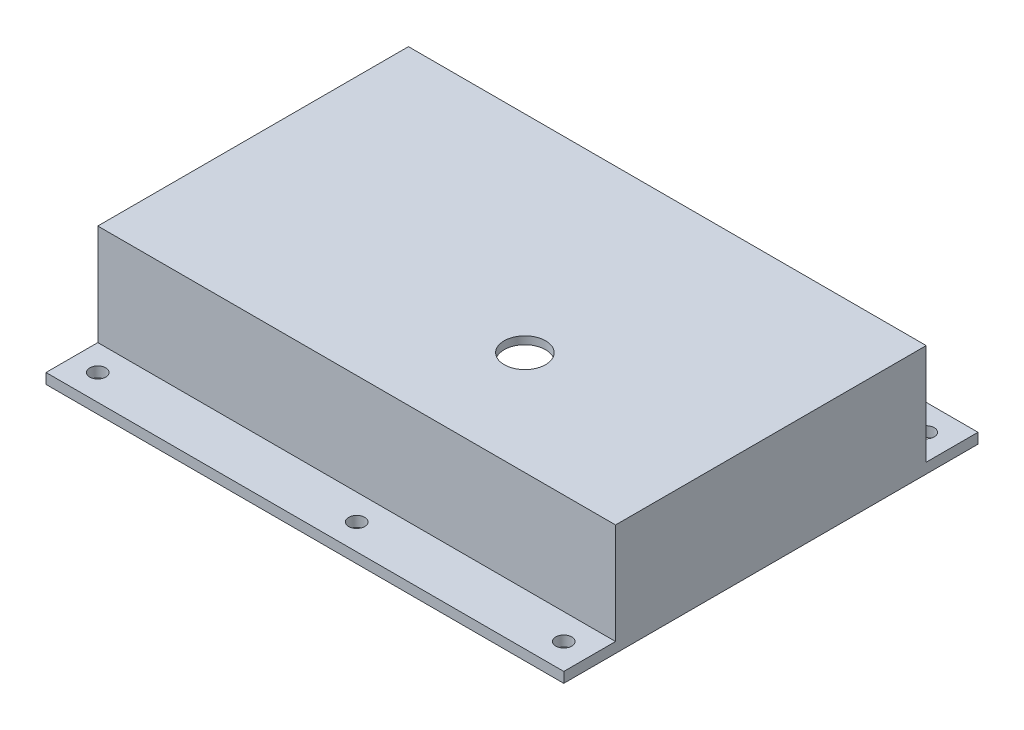
ISO-10303-21;
HEADER;
FILE_DESCRIPTION(('STEP AP214'),'2;1');
FILE_NAME('part.step','',(''),(''),'','','');
FILE_SCHEMA(('AUTOMOTIVE_DESIGN { 1 0 10303 214 1 1 1 1 }'));
ENDSEC;
DATA;
#1=APPLICATION_CONTEXT('core data for automotive mechanical design processes');
#2=APPLICATION_PROTOCOL_DEFINITION('international standard','automotive_design',2000,#1);
#3=PRODUCT_CONTEXT('',#1,'mechanical');
#4=PRODUCT('Part','Part','',(#3));
#5=PRODUCT_RELATED_PRODUCT_CATEGORY('part','',(#4));
#6=PRODUCT_DEFINITION_FORMATION('','',#4);
#7=PRODUCT_DEFINITION_CONTEXT('part definition',#1,'design');
#8=PRODUCT_DEFINITION('design','',#6,#7);
#9=PRODUCT_DEFINITION_SHAPE('','',#8);
#10=(LENGTH_UNIT() NAMED_UNIT(*) SI_UNIT(.MILLI.,.METRE.));
#11=(NAMED_UNIT(*) PLANE_ANGLE_UNIT() SI_UNIT($,.RADIAN.));
#12=(NAMED_UNIT(*) SI_UNIT($,.STERADIAN.) SOLID_ANGLE_UNIT());
#13=UNCERTAINTY_MEASURE_WITH_UNIT(LENGTH_MEASURE(1.E-05),#10,'distance_accuracy_value','');
#14=(GEOMETRIC_REPRESENTATION_CONTEXT(3) GLOBAL_UNCERTAINTY_ASSIGNED_CONTEXT((#13)) GLOBAL_UNIT_ASSIGNED_CONTEXT((#10,
#11,#12)) REPRESENTATION_CONTEXT('',''));
#15=CARTESIAN_POINT('',(0.,0.,0.));
#16=DIRECTION('',(0.,0.,1.));
#17=DIRECTION('',(1.,0.,0.));
#18=AXIS2_PLACEMENT_3D('',#15,#16,#17);
#19=CARTESIAN_POINT('',(0.,20.,-30.));
#20=DIRECTION('',(0.,0.,-1.));
#21=DIRECTION('',(-1.,0.,0.));
#22=AXIS2_PLACEMENT_3D('',#19,#20,#21);
#23=PLANE('',#22);
#24=DIRECTION('',(1.,0.,0.));
#25=VECTOR('',#24,1.);
#26=CARTESIAN_POINT('',(-50.,2.,-30.));
#27=LINE('',#26,#25);
#28=CARTESIAN_POINT('',(-50.,2.,-30.));
#29=VERTEX_POINT('',#28);
#30=CARTESIAN_POINT('',(50.,2.,-30.));
#31=VERTEX_POINT('',#30);
#32=EDGE_CURVE('E63',#29,#31,#27,.T.);
#33=ORIENTED_EDGE('',*,*,#32,.F.);
#34=DIRECTION('',(0.,-1.,0.));
#35=VECTOR('',#34,1.);
#36=CARTESIAN_POINT('',(-50.,20.,-30.));
#37=LINE('',#36,#35);
#38=CARTESIAN_POINT('',(-50.,21.5,-30.));
#39=VERTEX_POINT('',#38);
#40=EDGE_CURVE('E11',#39,#29,#37,.T.);
#41=ORIENTED_EDGE('',*,*,#40,.F.);
#42=DIRECTION('',(-1.,0.,0.));
#43=VECTOR('',#42,1.);
#44=CARTESIAN_POINT('',(-50.,21.5,-30.));
#45=LINE('',#44,#43);
#46=CARTESIAN_POINT('',(50.,21.5,-30.));
#47=VERTEX_POINT('',#46);
#48=EDGE_CURVE('E136',#47,#39,#45,.T.);
#49=ORIENTED_EDGE('',*,*,#48,.F.);
#50=DIRECTION('',(0.,-1.,0.));
#51=VECTOR('',#50,1.);
#52=CARTESIAN_POINT('',(50.,20.,-30.));
#53=LINE('',#52,#51);
#54=EDGE_CURVE('E134',#47,#31,#53,.T.);
#55=ORIENTED_EDGE('',*,*,#54,.T.);
#56=EDGE_LOOP('',(#33,#41,#49,#55));
#57=FACE_BOUND('',#56,.T.);
#58=ADVANCED_FACE('F46',(#57),#23,.T.);
#59=CARTESIAN_POINT('',(-50.,20.,0.));
#60=DIRECTION('',(-1.,0.,0.));
#61=DIRECTION('',(0.,0.,1.));
#62=AXIS2_PLACEMENT_3D('',#59,#60,#61);
#63=PLANE('',#62);
#64=DIRECTION('',(0.,0.,-1.));
#65=VECTOR('',#64,1.);
#66=CARTESIAN_POINT('',(-50.,0.,0.));
#67=LINE('',#66,#65);
#68=CARTESIAN_POINT('',(-50.,0.,40.));
#69=VERTEX_POINT('',#68);
#70=CARTESIAN_POINT('',(-50.,0.,-40.));
#71=VERTEX_POINT('',#70);
#72=EDGE_CURVE('E216',#69,#71,#67,.T.);
#73=ORIENTED_EDGE('',*,*,#72,.F.);
#74=DIRECTION('',(0.,-1.,0.));
#75=VECTOR('',#74,1.);
#76=CARTESIAN_POINT('',(-50.,0.,40.));
#77=LINE('',#76,#75);
#78=CARTESIAN_POINT('',(-50.,2.,40.));
#79=VERTEX_POINT('',#78);
#80=EDGE_CURVE('E169',#79,#69,#77,.T.);
#81=ORIENTED_EDGE('',*,*,#80,.F.);
#82=DIRECTION('',(0.,0.,1.));
#83=VECTOR('',#82,1.);
#84=CARTESIAN_POINT('',(-50.,2.,30.));
#85=LINE('',#84,#83);
#86=CARTESIAN_POINT('',(-50.,2.,30.));
#87=VERTEX_POINT('',#86);
#88=EDGE_CURVE('E166',#87,#79,#85,.T.);
#89=ORIENTED_EDGE('',*,*,#88,.F.);
#90=DIRECTION('',(0.,-1.,0.));
#91=VECTOR('',#90,1.);
#92=CARTESIAN_POINT('',(-50.,20.,30.));
#93=LINE('',#92,#91);
#94=CARTESIAN_POINT('',(-50.,21.5,30.));
#95=VERTEX_POINT('',#94);
#96=EDGE_CURVE('E55',#95,#87,#93,.T.);
#97=ORIENTED_EDGE('',*,*,#96,.F.);
#98=DIRECTION('',(0.,0.,1.));
#99=VECTOR('',#98,1.);
#100=CARTESIAN_POINT('',(-50.,21.5,-30.));
#101=LINE('',#100,#99);
#102=EDGE_CURVE('E180',#39,#95,#101,.T.);
#103=ORIENTED_EDGE('',*,*,#102,.F.);
#104=ORIENTED_EDGE('',*,*,#40,.T.);
#105=DIRECTION('',(0.,0.,1.));
#106=VECTOR('',#105,1.);
#107=CARTESIAN_POINT('',(-50.,2.,-30.));
#108=LINE('',#107,#106);
#109=CARTESIAN_POINT('',(-50.,2.,-40.));
#110=VERTEX_POINT('',#109);
#111=EDGE_CURVE('E149',#110,#29,#108,.T.);
#112=ORIENTED_EDGE('',*,*,#111,.F.);
#113=DIRECTION('',(0.,1.,0.));
#114=VECTOR('',#113,1.);
#115=CARTESIAN_POINT('',(-50.,0.,-40.));
#116=LINE('',#115,#114);
#117=EDGE_CURVE('E157',#71,#110,#116,.T.);
#118=ORIENTED_EDGE('',*,*,#117,.F.);
#119=EDGE_LOOP('',(#73,#81,#89,#97,#103,#104,#112,#118));
#120=FACE_BOUND('',#119,.T.);
#121=ADVANCED_FACE('F263',(#120),#63,.T.);
#122=CARTESIAN_POINT('',(0.,20.,30.));
#123=DIRECTION('',(0.,0.,-1.));
#124=DIRECTION('',(-1.,0.,0.));
#125=AXIS2_PLACEMENT_3D('',#122,#123,#124);
#126=PLANE('',#125);
#127=ORIENTED_EDGE('',*,*,#96,.T.);
#128=DIRECTION('',(1.,0.,0.));
#129=VECTOR('',#128,1.);
#130=CARTESIAN_POINT('',(-50.,2.,30.));
#131=LINE('',#130,#129);
#132=CARTESIAN_POINT('',(50.,2.,30.));
#133=VERTEX_POINT('',#132);
#134=EDGE_CURVE('E173',#87,#133,#131,.T.);
#135=ORIENTED_EDGE('',*,*,#134,.T.);
#136=DIRECTION('',(0.,-1.,0.));
#137=VECTOR('',#136,1.);
#138=CARTESIAN_POINT('',(50.,20.,30.));
#139=LINE('',#138,#137);
#140=CARTESIAN_POINT('',(50.,21.5,30.));
#141=VERTEX_POINT('',#140);
#142=EDGE_CURVE('E141',#141,#133,#139,.T.);
#143=ORIENTED_EDGE('',*,*,#142,.F.);
#144=DIRECTION('',(1.,0.,0.));
#145=VECTOR('',#144,1.);
#146=CARTESIAN_POINT('',(-50.,21.5,30.));
#147=LINE('',#146,#145);
#148=EDGE_CURVE('E186',#95,#141,#147,.T.);
#149=ORIENTED_EDGE('',*,*,#148,.F.);
#150=EDGE_LOOP('',(#127,#135,#143,#149));
#151=FACE_BOUND('',#150,.T.);
#152=ADVANCED_FACE('F268',(#151),#126,.F.);
#153=CARTESIAN_POINT('',(48.5,20.,0.));
#154=DIRECTION('',(-1.,0.,0.));
#155=DIRECTION('',(0.,0.,1.));
#156=AXIS2_PLACEMENT_3D('',#153,#154,#155);
#157=PLANE('',#156);
#158=DIRECTION('',(0.,0.,-1.));
#159=VECTOR('',#158,1.);
#160=CARTESIAN_POINT('',(48.5,0.,0.));
#161=LINE('',#160,#159);
#162=CARTESIAN_POINT('',(48.5,0.,28.5));
#163=VERTEX_POINT('',#162);
#164=CARTESIAN_POINT('',(48.5,0.,-28.5));
#165=VERTEX_POINT('',#164);
#166=EDGE_CURVE('E192',#163,#165,#161,.T.);
#167=ORIENTED_EDGE('',*,*,#166,.F.);
#168=DIRECTION('',(0.,-1.,0.));
#169=VECTOR('',#168,1.);
#170=CARTESIAN_POINT('',(48.5,20.,28.5));
#171=LINE('',#170,#169);
#172=CARTESIAN_POINT('',(48.5,20.,28.5));
#173=VERTEX_POINT('',#172);
#174=EDGE_CURVE('E50',#173,#163,#171,.T.);
#175=ORIENTED_EDGE('',*,*,#174,.F.);
#176=DIRECTION('',(0.,0.,-1.));
#177=VECTOR('',#176,1.);
#178=CARTESIAN_POINT('',(48.5,20.,0.));
#179=LINE('',#178,#177);
#180=CARTESIAN_POINT('',(48.5,20.,-28.5));
#181=VERTEX_POINT('',#180);
#182=EDGE_CURVE('E193',#173,#181,#179,.T.);
#183=ORIENTED_EDGE('',*,*,#182,.T.);
#184=DIRECTION('',(0.,-1.,0.));
#185=VECTOR('',#184,1.);
#186=CARTESIAN_POINT('',(48.5,20.,-28.5));
#187=LINE('',#186,#185);
#188=EDGE_CURVE('E205',#181,#165,#187,.T.);
#189=ORIENTED_EDGE('',*,*,#188,.T.);
#190=EDGE_LOOP('',(#167,#175,#183,#189));
#191=FACE_BOUND('',#190,.T.);
#192=ADVANCED_FACE('F48',(#191),#157,.T.);
#193=CARTESIAN_POINT('',(0.,20.,28.5));
#194=DIRECTION('',(0.,0.,-1.));
#195=DIRECTION('',(-1.,0.,0.));
#196=AXIS2_PLACEMENT_3D('',#193,#194,#195);
#197=PLANE('',#196);
#198=DIRECTION('',(1.,0.,0.));
#199=VECTOR('',#198,1.);
#200=CARTESIAN_POINT('',(0.,0.,28.5));
#201=LINE('',#200,#199);
#202=CARTESIAN_POINT('',(-48.5,0.,28.5));
#203=VERTEX_POINT('',#202);
#204=EDGE_CURVE('E208',#203,#163,#201,.T.);
#205=ORIENTED_EDGE('',*,*,#204,.F.);
#206=DIRECTION('',(0.,-1.,0.));
#207=VECTOR('',#206,1.);
#208=CARTESIAN_POINT('',(-48.5,20.,28.5));
#209=LINE('',#208,#207);
#210=CARTESIAN_POINT('',(-48.5,20.,28.5));
#211=VERTEX_POINT('',#210);
#212=EDGE_CURVE('E226',#211,#203,#209,.T.);
#213=ORIENTED_EDGE('',*,*,#212,.F.);
#214=DIRECTION('',(1.,0.,0.));
#215=VECTOR('',#214,1.);
#216=CARTESIAN_POINT('',(0.,20.,28.5));
#217=LINE('',#216,#215);
#218=EDGE_CURVE('E195',#211,#173,#217,.T.);
#219=ORIENTED_EDGE('',*,*,#218,.T.);
#220=ORIENTED_EDGE('',*,*,#174,.T.);
#221=EDGE_LOOP('',(#205,#213,#219,#220));
#222=FACE_BOUND('',#221,.T.);
#223=ADVANCED_FACE('F233',(#222),#197,.T.);
#224=CARTESIAN_POINT('',(-48.5,20.,0.));
#225=DIRECTION('',(-1.,0.,0.));
#226=DIRECTION('',(0.,0.,1.));
#227=AXIS2_PLACEMENT_3D('',#224,#225,#226);
#228=PLANE('',#227);
#229=DIRECTION('',(0.,0.,-1.));
#230=VECTOR('',#229,1.);
#231=CARTESIAN_POINT('',(-48.5,0.,0.));
#232=LINE('',#231,#230);
#233=CARTESIAN_POINT('',(-48.5,0.,-28.5));
#234=VERTEX_POINT('',#233);
#235=EDGE_CURVE('E211',#203,#234,#232,.T.);
#236=ORIENTED_EDGE('',*,*,#235,.T.);
#237=DIRECTION('',(0.,-1.,0.));
#238=VECTOR('',#237,1.);
#239=CARTESIAN_POINT('',(-48.5,20.,-28.5));
#240=LINE('',#239,#238);
#241=CARTESIAN_POINT('',(-48.5,20.,-28.5));
#242=VERTEX_POINT('',#241);
#243=EDGE_CURVE('E224',#242,#234,#240,.T.);
#244=ORIENTED_EDGE('',*,*,#243,.F.);
#245=DIRECTION('',(0.,0.,-1.));
#246=VECTOR('',#245,1.);
#247=CARTESIAN_POINT('',(-48.5,20.,0.));
#248=LINE('',#247,#246);
#249=EDGE_CURVE('E199',#211,#242,#248,.T.);
#250=ORIENTED_EDGE('',*,*,#249,.F.);
#251=ORIENTED_EDGE('',*,*,#212,.T.);
#252=EDGE_LOOP('',(#236,#244,#250,#251));
#253=FACE_BOUND('',#252,.T.);
#254=ADVANCED_FACE('F242',(#253),#228,.F.);
#255=CARTESIAN_POINT('',(0.,20.,-28.5));
#256=DIRECTION('',(0.,0.,-1.));
#257=DIRECTION('',(-1.,0.,0.));
#258=AXIS2_PLACEMENT_3D('',#255,#256,#257);
#259=PLANE('',#258);
#260=DIRECTION('',(1.,0.,0.));
#261=VECTOR('',#260,1.);
#262=CARTESIAN_POINT('',(0.,0.,-28.5));
#263=LINE('',#262,#261);
#264=EDGE_CURVE('E213',#234,#165,#263,.T.);
#265=ORIENTED_EDGE('',*,*,#264,.T.);
#266=ORIENTED_EDGE('',*,*,#188,.F.);
#267=DIRECTION('',(1.,0.,0.));
#268=VECTOR('',#267,1.);
#269=CARTESIAN_POINT('',(0.,20.,-28.5));
#270=LINE('',#269,#268);
#271=EDGE_CURVE('E202',#242,#181,#270,.T.);
#272=ORIENTED_EDGE('',*,*,#271,.F.);
#273=ORIENTED_EDGE('',*,*,#243,.T.);
#274=EDGE_LOOP('',(#265,#266,#272,#273));
#275=FACE_BOUND('',#274,.T.);
#276=ADVANCED_FACE('F245',(#275),#259,.F.);
#277=CARTESIAN_POINT('',(50.,20.,0.));
#278=DIRECTION('',(-1.,0.,0.));
#279=DIRECTION('',(0.,0.,1.));
#280=AXIS2_PLACEMENT_3D('',#277,#278,#279);
#281=PLANE('',#280);
#282=DIRECTION('',(0.,0.,-1.));
#283=VECTOR('',#282,1.);
#284=CARTESIAN_POINT('',(50.,0.,0.));
#285=LINE('',#284,#283);
#286=CARTESIAN_POINT('',(50.,0.,40.));
#287=VERTEX_POINT('',#286);
#288=CARTESIAN_POINT('',(50.,0.,-40.));
#289=VERTEX_POINT('',#288);
#290=EDGE_CURVE('E196',#287,#289,#285,.T.);
#291=ORIENTED_EDGE('',*,*,#290,.T.);
#292=DIRECTION('',(0.,1.,0.));
#293=VECTOR('',#292,1.);
#294=CARTESIAN_POINT('',(50.,0.,-40.));
#295=LINE('',#294,#293);
#296=CARTESIAN_POINT('',(50.,2.,-40.));
#297=VERTEX_POINT('',#296);
#298=EDGE_CURVE('E156',#289,#297,#295,.T.);
#299=ORIENTED_EDGE('',*,*,#298,.T.);
#300=DIRECTION('',(0.,0.,1.));
#301=VECTOR('',#300,1.);
#302=CARTESIAN_POINT('',(50.,2.,-30.));
#303=LINE('',#302,#301);
#304=EDGE_CURVE('E147',#297,#31,#303,.T.);
#305=ORIENTED_EDGE('',*,*,#304,.T.);
#306=ORIENTED_EDGE('',*,*,#54,.F.);
#307=DIRECTION('',(0.,0.,-1.));
#308=VECTOR('',#307,1.);
#309=CARTESIAN_POINT('',(50.,21.5,-30.));
#310=LINE('',#309,#308);
#311=EDGE_CURVE('E189',#141,#47,#310,.T.);
#312=ORIENTED_EDGE('',*,*,#311,.F.);
#313=ORIENTED_EDGE('',*,*,#142,.T.);
#314=DIRECTION('',(0.,0.,1.));
#315=VECTOR('',#314,1.);
#316=CARTESIAN_POINT('',(50.,2.,30.));
#317=LINE('',#316,#315);
#318=CARTESIAN_POINT('',(50.,2.,40.));
#319=VERTEX_POINT('',#318);
#320=EDGE_CURVE('E70',#133,#319,#317,.T.);
#321=ORIENTED_EDGE('',*,*,#320,.T.);
#322=DIRECTION('',(0.,-1.,0.));
#323=VECTOR('',#322,1.);
#324=CARTESIAN_POINT('',(50.,0.,40.));
#325=LINE('',#324,#323);
#326=EDGE_CURVE('E170',#319,#287,#325,.T.);
#327=ORIENTED_EDGE('',*,*,#326,.T.);
#328=EDGE_LOOP('',(#291,#299,#305,#306,#312,#313,#321,#327));
#329=FACE_BOUND('',#328,.T.);
#330=ADVANCED_FACE('F154',(#329),#281,.F.);
#331=CARTESIAN_POINT('',(0.,0.,0.));
#332=DIRECTION('',(0.,1.,0.));
#333=DIRECTION('',(0.,0.,1.));
#334=AXIS2_PLACEMENT_3D('',#331,#332,#333);
#335=PLANE('',#334);
#336=CARTESIAN_POINT('',(45.,0.,35.));
#337=DIRECTION('',(0.,-1.,0.));
#338=DIRECTION('',(0.,0.,-1.));
#339=AXIS2_PLACEMENT_3D('',#336,#337,#338);
#340=CIRCLE('',#339,1.55);
#341=CARTESIAN_POINT('',(45.,0.,33.45));
#342=VERTEX_POINT('',#341);
#343=EDGE_CURVE('E546',#342,#342,#340,.T.);
#344=ORIENTED_EDGE('',*,*,#343,.F.);
#345=EDGE_LOOP('',(#344));
#346=FACE_BOUND('',#345,.T.);
#347=CARTESIAN_POINT('',(45.,0.,-35.));
#348=DIRECTION('',(0.,-1.,0.));
#349=DIRECTION('',(0.,0.,-1.));
#350=AXIS2_PLACEMENT_3D('',#347,#348,#349);
#351=CIRCLE('',#350,1.55);
#352=CARTESIAN_POINT('',(45.,0.,-36.55));
#353=VERTEX_POINT('',#352);
#354=EDGE_CURVE('E565',#353,#353,#351,.T.);
#355=ORIENTED_EDGE('',*,*,#354,.F.);
#356=EDGE_LOOP('',(#355));
#357=FACE_BOUND('',#356,.T.);
#358=CARTESIAN_POINT('',(-45.,0.,-35.));
#359=DIRECTION('',(0.,-1.,0.));
#360=DIRECTION('',(0.,0.,-1.));
#361=AXIS2_PLACEMENT_3D('',#358,#359,#360);
#362=CIRCLE('',#361,1.55);
#363=CARTESIAN_POINT('',(-45.,0.,-36.55));
#364=VERTEX_POINT('',#363);
#365=EDGE_CURVE('E559',#364,#364,#362,.T.);
#366=ORIENTED_EDGE('',*,*,#365,.F.);
#367=EDGE_LOOP('',(#366));
#368=FACE_BOUND('',#367,.T.);
#369=CARTESIAN_POINT('',(4.99999999999999,0.,35.));
#370=DIRECTION('',(0.,-1.,0.));
#371=DIRECTION('',(0.,0.,-1.));
#372=AXIS2_PLACEMENT_3D('',#369,#370,#371);
#373=CIRCLE('',#372,1.55);
#374=CARTESIAN_POINT('',(4.99999999999999,0.,33.45));
#375=VERTEX_POINT('',#374);
#376=EDGE_CURVE('E552',#375,#375,#373,.T.);
#377=ORIENTED_EDGE('',*,*,#376,.F.);
#378=EDGE_LOOP('',(#377));
#379=FACE_BOUND('',#378,.T.);
#380=CARTESIAN_POINT('',(5.00000000000001,0.,-35.));
#381=DIRECTION('',(0.,-1.,0.));
#382=DIRECTION('',(0.,0.,-1.));
#383=AXIS2_PLACEMENT_3D('',#380,#381,#382);
#384=CIRCLE('',#383,1.55);
#385=CARTESIAN_POINT('',(5.00000000000001,0.,-36.55));
#386=VERTEX_POINT('',#385);
#387=EDGE_CURVE('E553',#386,#386,#384,.T.);
#388=ORIENTED_EDGE('',*,*,#387,.F.);
#389=EDGE_LOOP('',(#388));
#390=FACE_BOUND('',#389,.T.);
#391=CARTESIAN_POINT('',(-45.,0.,35.));
#392=DIRECTION('',(0.,-1.,0.));
#393=DIRECTION('',(0.,0.,-1.));
#394=AXIS2_PLACEMENT_3D('',#391,#392,#393);
#395=CIRCLE('',#394,1.55);
#396=CARTESIAN_POINT('',(-45.,0.,33.45));
#397=VERTEX_POINT('',#396);
#398=EDGE_CURVE('E543',#397,#397,#395,.T.);
#399=ORIENTED_EDGE('',*,*,#398,.F.);
#400=EDGE_LOOP('',(#399));
#401=FACE_BOUND('',#400,.T.);
#402=ORIENTED_EDGE('',*,*,#166,.T.);
#403=ORIENTED_EDGE('',*,*,#264,.F.);
#404=ORIENTED_EDGE('',*,*,#235,.F.);
#405=ORIENTED_EDGE('',*,*,#204,.T.);
#406=EDGE_LOOP('',(#402,#403,#404,#405));
#407=FACE_BOUND('',#406,.T.);
#408=ORIENTED_EDGE('',*,*,#72,.T.);
#409=DIRECTION('',(1.,0.,0.));
#410=VECTOR('',#409,1.);
#411=CARTESIAN_POINT('',(-50.,0.,-40.));
#412=LINE('',#411,#410);
#413=EDGE_CURVE('E164',#71,#289,#412,.T.);
#414=ORIENTED_EDGE('',*,*,#413,.T.);
#415=ORIENTED_EDGE('',*,*,#290,.F.);
#416=DIRECTION('',(1.,0.,0.));
#417=VECTOR('',#416,1.);
#418=CARTESIAN_POINT('',(-50.,0.,40.));
#419=LINE('',#418,#417);
#420=EDGE_CURVE('E177',#69,#287,#419,.T.);
#421=ORIENTED_EDGE('',*,*,#420,.F.);
#422=EDGE_LOOP('',(#408,#414,#415,#421));
#423=FACE_BOUND('',#422,.T.);
#424=ADVANCED_FACE('F240',(#346,#357,#368,#379,#390,#401,#407,#423),#335,.F.);
#425=CARTESIAN_POINT('',(0.,20.,0.));
#426=DIRECTION('',(0.,1.,0.));
#427=DIRECTION('',(0.,0.,1.));
#428=AXIS2_PLACEMENT_3D('',#425,#426,#427);
#429=PLANE('',#428);
#430=CARTESIAN_POINT('',(12.44,20.,9.95000000000001));
#431=DIRECTION('',(0.,1.,0.));
#432=DIRECTION('',(0.,0.,1.));
#433=AXIS2_PLACEMENT_3D('',#430,#431,#432);
#434=CIRCLE('',#433,4.);
#435=CARTESIAN_POINT('',(12.44,20.,13.95));
#436=VERTEX_POINT('',#435);
#437=EDGE_CURVE('E576',#436,#436,#434,.T.);
#438=ORIENTED_EDGE('',*,*,#437,.T.);
#439=EDGE_LOOP('',(#438));
#440=FACE_BOUND('',#439,.T.);
#441=ORIENTED_EDGE('',*,*,#182,.F.);
#442=ORIENTED_EDGE('',*,*,#218,.F.);
#443=ORIENTED_EDGE('',*,*,#249,.T.);
#444=ORIENTED_EDGE('',*,*,#271,.T.);
#445=EDGE_LOOP('',(#441,#442,#443,#444));
#446=FACE_BOUND('',#445,.T.);
#447=ADVANCED_FACE('F247',(#440,#446),#429,.F.);
#448=CARTESIAN_POINT('',(0.,21.5,0.));
#449=DIRECTION('',(0.,1.,0.));
#450=DIRECTION('',(0.,0.,1.));
#451=AXIS2_PLACEMENT_3D('',#448,#449,#450);
#452=PLANE('',#451);
#453=CARTESIAN_POINT('',(12.44,21.5,9.95000000000001));
#454=DIRECTION('',(0.,1.,0.));
#455=DIRECTION('',(0.,0.,1.));
#456=AXIS2_PLACEMENT_3D('',#453,#454,#455);
#457=CIRCLE('',#456,4.);
#458=CARTESIAN_POINT('',(12.44,21.5,13.95));
#459=VERTEX_POINT('',#458);
#460=EDGE_CURVE('E580',#459,#459,#457,.T.);
#461=ORIENTED_EDGE('',*,*,#460,.F.);
#462=EDGE_LOOP('',(#461));
#463=FACE_BOUND('',#462,.T.);
#464=ORIENTED_EDGE('',*,*,#102,.T.);
#465=ORIENTED_EDGE('',*,*,#148,.T.);
#466=ORIENTED_EDGE('',*,*,#311,.T.);
#467=ORIENTED_EDGE('',*,*,#48,.T.);
#468=EDGE_LOOP('',(#464,#465,#466,#467));
#469=FACE_BOUND('',#468,.T.);
#470=ADVANCED_FACE('F249',(#463,#469),#452,.T.);
#471=CARTESIAN_POINT('',(-50.,0.,40.));
#472=DIRECTION('',(0.,0.,1.));
#473=DIRECTION('',(1.,0.,0.));
#474=AXIS2_PLACEMENT_3D('',#471,#472,#473);
#475=PLANE('',#474);
#476=ORIENTED_EDGE('',*,*,#326,.F.);
#477=DIRECTION('',(1.,0.,0.));
#478=VECTOR('',#477,1.);
#479=CARTESIAN_POINT('',(-50.,2.,40.));
#480=LINE('',#479,#478);
#481=EDGE_CURVE('E181',#79,#319,#480,.T.);
#482=ORIENTED_EDGE('',*,*,#481,.F.);
#483=ORIENTED_EDGE('',*,*,#80,.T.);
#484=ORIENTED_EDGE('',*,*,#420,.T.);
#485=EDGE_LOOP('',(#476,#482,#483,#484));
#486=FACE_BOUND('',#485,.T.);
#487=ADVANCED_FACE('F256',(#486),#475,.T.);
#488=CARTESIAN_POINT('',(-50.,2.,30.));
#489=DIRECTION('',(0.,1.,0.));
#490=DIRECTION('',(0.,0.,1.));
#491=AXIS2_PLACEMENT_3D('',#488,#489,#490);
#492=PLANE('',#491);
#493=CARTESIAN_POINT('',(45.,2.,35.));
#494=DIRECTION('',(0.,-1.,0.));
#495=DIRECTION('',(0.,0.,-1.));
#496=AXIS2_PLACEMENT_3D('',#493,#494,#495);
#497=CIRCLE('',#496,1.55);
#498=CARTESIAN_POINT('',(45.,2.,33.45));
#499=VERTEX_POINT('',#498);
#500=EDGE_CURVE('E568',#499,#499,#497,.T.);
#501=ORIENTED_EDGE('',*,*,#500,.T.);
#502=EDGE_LOOP('',(#501));
#503=FACE_BOUND('',#502,.T.);
#504=CARTESIAN_POINT('',(4.99999999999999,2.,35.));
#505=DIRECTION('',(0.,-1.,0.));
#506=DIRECTION('',(0.,0.,-1.));
#507=AXIS2_PLACEMENT_3D('',#504,#505,#506);
#508=CIRCLE('',#507,1.55);
#509=CARTESIAN_POINT('',(4.99999999999999,2.,33.45));
#510=VERTEX_POINT('',#509);
#511=EDGE_CURVE('E549',#510,#510,#508,.T.);
#512=ORIENTED_EDGE('',*,*,#511,.T.);
#513=EDGE_LOOP('',(#512));
#514=FACE_BOUND('',#513,.T.);
#515=CARTESIAN_POINT('',(-45.,2.,35.));
#516=DIRECTION('',(0.,-1.,0.));
#517=DIRECTION('',(0.,0.,-1.));
#518=AXIS2_PLACEMENT_3D('',#515,#516,#517);
#519=CIRCLE('',#518,1.55);
#520=CARTESIAN_POINT('',(-45.,2.,33.45));
#521=VERTEX_POINT('',#520);
#522=EDGE_CURVE('E151',#521,#521,#519,.T.);
#523=ORIENTED_EDGE('',*,*,#522,.T.);
#524=EDGE_LOOP('',(#523));
#525=FACE_BOUND('',#524,.T.);
#526=ORIENTED_EDGE('',*,*,#320,.F.);
#527=ORIENTED_EDGE('',*,*,#134,.F.);
#528=ORIENTED_EDGE('',*,*,#88,.T.);
#529=ORIENTED_EDGE('',*,*,#481,.T.);
#530=EDGE_LOOP('',(#526,#527,#528,#529));
#531=FACE_BOUND('',#530,.T.);
#532=ADVANCED_FACE('F309',(#503,#514,#525,#531),#492,.T.);
#533=CARTESIAN_POINT('',(-50.,2.,-30.));
#534=DIRECTION('',(0.,1.,0.));
#535=DIRECTION('',(0.,0.,1.));
#536=AXIS2_PLACEMENT_3D('',#533,#534,#535);
#537=PLANE('',#536);
#538=CARTESIAN_POINT('',(45.,2.,-35.));
#539=DIRECTION('',(0.,-1.,0.));
#540=DIRECTION('',(0.,0.,-1.));
#541=AXIS2_PLACEMENT_3D('',#538,#539,#540);
#542=CIRCLE('',#541,1.55);
#543=CARTESIAN_POINT('',(45.,2.,-36.55));
#544=VERTEX_POINT('',#543);
#545=EDGE_CURVE('E562',#544,#544,#542,.T.);
#546=ORIENTED_EDGE('',*,*,#545,.T.);
#547=EDGE_LOOP('',(#546));
#548=FACE_BOUND('',#547,.T.);
#549=CARTESIAN_POINT('',(-45.,2.,-35.));
#550=DIRECTION('',(0.,-1.,0.));
#551=DIRECTION('',(0.,0.,-1.));
#552=AXIS2_PLACEMENT_3D('',#549,#550,#551);
#553=CIRCLE('',#552,1.55);
#554=CARTESIAN_POINT('',(-45.,2.,-36.55));
#555=VERTEX_POINT('',#554);
#556=EDGE_CURVE('E556',#555,#555,#553,.T.);
#557=ORIENTED_EDGE('',*,*,#556,.T.);
#558=EDGE_LOOP('',(#557));
#559=FACE_BOUND('',#558,.T.);
#560=CARTESIAN_POINT('',(5.00000000000001,2.,-35.));
#561=DIRECTION('',(0.,-1.,0.));
#562=DIRECTION('',(0.,0.,-1.));
#563=AXIS2_PLACEMENT_3D('',#560,#561,#562);
#564=CIRCLE('',#563,1.55);
#565=CARTESIAN_POINT('',(5.00000000000001,2.,-36.55));
#566=VERTEX_POINT('',#565);
#567=EDGE_CURVE('E573',#566,#566,#564,.T.);
#568=ORIENTED_EDGE('',*,*,#567,.T.);
#569=EDGE_LOOP('',(#568));
#570=FACE_BOUND('',#569,.T.);
#571=ORIENTED_EDGE('',*,*,#304,.F.);
#572=DIRECTION('',(1.,0.,0.));
#573=VECTOR('',#572,1.);
#574=CARTESIAN_POINT('',(-50.,2.,-40.));
#575=LINE('',#574,#573);
#576=EDGE_CURVE('E150',#110,#297,#575,.T.);
#577=ORIENTED_EDGE('',*,*,#576,.F.);
#578=ORIENTED_EDGE('',*,*,#111,.T.);
#579=ORIENTED_EDGE('',*,*,#32,.T.);
#580=EDGE_LOOP('',(#571,#577,#578,#579));
#581=FACE_BOUND('',#580,.T.);
#582=ADVANCED_FACE('F146',(#548,#559,#570,#581),#537,.T.);
#583=CARTESIAN_POINT('',(-50.,0.,-40.));
#584=DIRECTION('',(0.,0.,-1.));
#585=DIRECTION('',(-1.,0.,0.));
#586=AXIS2_PLACEMENT_3D('',#583,#584,#585);
#587=PLANE('',#586);
#588=ORIENTED_EDGE('',*,*,#298,.F.);
#589=ORIENTED_EDGE('',*,*,#413,.F.);
#590=ORIENTED_EDGE('',*,*,#117,.T.);
#591=ORIENTED_EDGE('',*,*,#576,.T.);
#592=EDGE_LOOP('',(#588,#589,#590,#591));
#593=FACE_BOUND('',#592,.T.);
#594=ADVANCED_FACE('F305',(#593),#587,.T.);
#595=CARTESIAN_POINT('',(5.00000000000001,2.,-35.));
#596=DIRECTION('',(0.,-1.,0.));
#597=DIRECTION('',(0.,0.,-1.));
#598=AXIS2_PLACEMENT_3D('',#595,#596,#597);
#599=CYLINDRICAL_SURFACE('',#598,1.55);
#600=ORIENTED_EDGE('',*,*,#567,.F.);
#601=EDGE_LOOP('',(#600));
#602=FACE_BOUND('',#601,.T.);
#603=ORIENTED_EDGE('',*,*,#387,.T.);
#604=EDGE_LOOP('',(#603));
#605=FACE_BOUND('',#604,.T.);
#606=ADVANCED_FACE('F331',(#602,#605),#599,.F.);
#607=CARTESIAN_POINT('',(-45.,2.,-35.));
#608=DIRECTION('',(0.,-1.,0.));
#609=DIRECTION('',(0.,0.,-1.));
#610=AXIS2_PLACEMENT_3D('',#607,#608,#609);
#611=CYLINDRICAL_SURFACE('',#610,1.55);
#612=ORIENTED_EDGE('',*,*,#556,.F.);
#613=EDGE_LOOP('',(#612));
#614=FACE_BOUND('',#613,.T.);
#615=ORIENTED_EDGE('',*,*,#365,.T.);
#616=EDGE_LOOP('',(#615));
#617=FACE_BOUND('',#616,.T.);
#618=ADVANCED_FACE('F336',(#614,#617),#611,.F.);
#619=CARTESIAN_POINT('',(45.,2.,-35.));
#620=DIRECTION('',(0.,-1.,0.));
#621=DIRECTION('',(0.,0.,-1.));
#622=AXIS2_PLACEMENT_3D('',#619,#620,#621);
#623=CYLINDRICAL_SURFACE('',#622,1.55);
#624=ORIENTED_EDGE('',*,*,#545,.F.);
#625=EDGE_LOOP('',(#624));
#626=FACE_BOUND('',#625,.T.);
#627=ORIENTED_EDGE('',*,*,#354,.T.);
#628=EDGE_LOOP('',(#627));
#629=FACE_BOUND('',#628,.T.);
#630=ADVANCED_FACE('F347',(#626,#629),#623,.F.);
#631=CARTESIAN_POINT('',(-45.,2.,35.));
#632=DIRECTION('',(0.,-1.,0.));
#633=DIRECTION('',(0.,0.,-1.));
#634=AXIS2_PLACEMENT_3D('',#631,#632,#633);
#635=CYLINDRICAL_SURFACE('',#634,1.55);
#636=ORIENTED_EDGE('',*,*,#522,.F.);
#637=EDGE_LOOP('',(#636));
#638=FACE_BOUND('',#637,.T.);
#639=ORIENTED_EDGE('',*,*,#398,.T.);
#640=EDGE_LOOP('',(#639));
#641=FACE_BOUND('',#640,.T.);
#642=ADVANCED_FACE('F358',(#638,#641),#635,.F.);
#643=CARTESIAN_POINT('',(4.99999999999999,2.,35.));
#644=DIRECTION('',(0.,-1.,0.));
#645=DIRECTION('',(0.,0.,-1.));
#646=AXIS2_PLACEMENT_3D('',#643,#644,#645);
#647=CYLINDRICAL_SURFACE('',#646,1.55);
#648=ORIENTED_EDGE('',*,*,#511,.F.);
#649=EDGE_LOOP('',(#648));
#650=FACE_BOUND('',#649,.T.);
#651=ORIENTED_EDGE('',*,*,#376,.T.);
#652=EDGE_LOOP('',(#651));
#653=FACE_BOUND('',#652,.T.);
#654=ADVANCED_FACE('F369',(#650,#653),#647,.F.);
#655=CARTESIAN_POINT('',(45.,2.,35.));
#656=DIRECTION('',(0.,-1.,0.));
#657=DIRECTION('',(0.,0.,-1.));
#658=AXIS2_PLACEMENT_3D('',#655,#656,#657);
#659=CYLINDRICAL_SURFACE('',#658,1.55);
#660=ORIENTED_EDGE('',*,*,#500,.F.);
#661=EDGE_LOOP('',(#660));
#662=FACE_BOUND('',#661,.T.);
#663=ORIENTED_EDGE('',*,*,#343,.T.);
#664=EDGE_LOOP('',(#663));
#665=FACE_BOUND('',#664,.T.);
#666=ADVANCED_FACE('F380',(#662,#665),#659,.F.);
#667=CARTESIAN_POINT('',(12.44,18.5,9.95000000000001));
#668=DIRECTION('',(0.,1.,0.));
#669=DIRECTION('',(0.,0.,1.));
#670=AXIS2_PLACEMENT_3D('',#667,#668,#669);
#671=CYLINDRICAL_SURFACE('',#670,4.);
#672=ORIENTED_EDGE('',*,*,#460,.T.);
#673=EDGE_LOOP('',(#672));
#674=FACE_BOUND('',#673,.T.);
#675=ORIENTED_EDGE('',*,*,#437,.F.);
#676=EDGE_LOOP('',(#675));
#677=FACE_BOUND('',#676,.T.);
#678=ADVANCED_FACE('F390',(#674,#677),#671,.F.);
#679=CLOSED_SHELL('',(#58,#121,#152,#192,#223,#254,#276,#330,#424,#447,#470,#487,#532,#582,#594,
#606,#618,#630,#642,#654,#666,#678));
#680=MANIFOLD_SOLID_BREP('B2',#679);
#681=ADVANCED_BREP_SHAPE_REPRESENTATION('',(#18,#680),#14);
#682=SHAPE_DEFINITION_REPRESENTATION(#9,#681);
ENDSEC;
END-ISO-10303-21;
